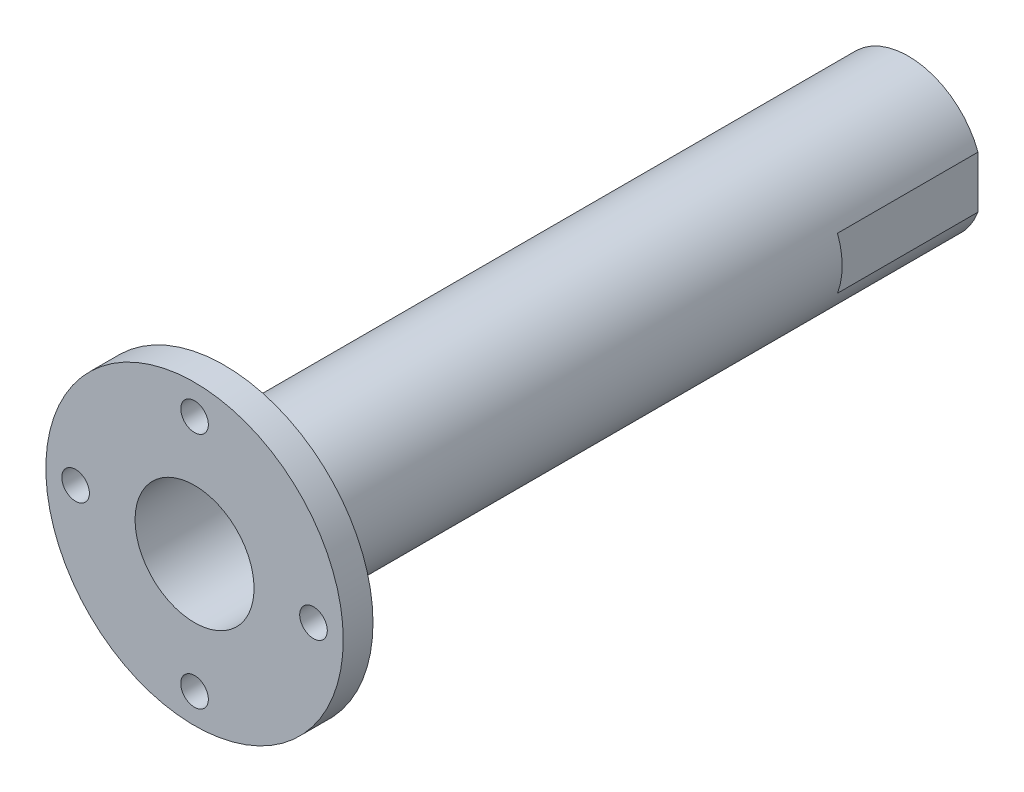
ISO-10303-21;
HEADER;
FILE_DESCRIPTION(('STEP AP214'),'2;1');
FILE_NAME('part.step','',(''),(''),'','','');
FILE_SCHEMA(('AUTOMOTIVE_DESIGN { 1 0 10303 214 1 1 1 1 }'));
ENDSEC;
DATA;
#1=APPLICATION_CONTEXT('core data for automotive mechanical design processes');
#2=APPLICATION_PROTOCOL_DEFINITION('international standard','automotive_design',2000,#1);
#3=PRODUCT_CONTEXT('',#1,'mechanical');
#4=PRODUCT('Part','Part','',(#3));
#5=PRODUCT_RELATED_PRODUCT_CATEGORY('part','',(#4));
#6=PRODUCT_DEFINITION_FORMATION('','',#4);
#7=PRODUCT_DEFINITION_CONTEXT('part definition',#1,'design');
#8=PRODUCT_DEFINITION('design','',#6,#7);
#9=PRODUCT_DEFINITION_SHAPE('','',#8);
#10=(LENGTH_UNIT() NAMED_UNIT(*) SI_UNIT(.MILLI.,.METRE.));
#11=(NAMED_UNIT(*) PLANE_ANGLE_UNIT() SI_UNIT($,.RADIAN.));
#12=(NAMED_UNIT(*) SI_UNIT($,.STERADIAN.) SOLID_ANGLE_UNIT());
#13=UNCERTAINTY_MEASURE_WITH_UNIT(LENGTH_MEASURE(1.E-05),#10,'distance_accuracy_value','');
#14=(GEOMETRIC_REPRESENTATION_CONTEXT(3) GLOBAL_UNCERTAINTY_ASSIGNED_CONTEXT((#13)) GLOBAL_UNIT_ASSIGNED_CONTEXT((#10,
#11,#12)) REPRESENTATION_CONTEXT('',''));
#15=CARTESIAN_POINT('',(0.,0.,0.));
#16=DIRECTION('',(0.,0.,1.));
#17=DIRECTION('',(1.,0.,0.));
#18=AXIS2_PLACEMENT_3D('',#15,#16,#17);
#19=CARTESIAN_POINT('',(0.,0.,76.2));
#20=DIRECTION('',(0.,0.,-1.));
#21=DIRECTION('',(-1.,0.,0.));
#22=AXIS2_PLACEMENT_3D('',#19,#20,#21);
#23=CYLINDRICAL_SURFACE('',#22,7.9375);
#24=CARTESIAN_POINT('',(0.,0.,15.));
#25=DIRECTION('',(0.,0.,-1.));
#26=DIRECTION('',(-1.,0.,0.));
#27=AXIS2_PLACEMENT_3D('',#24,#25,#26);
#28=CIRCLE('',#27,7.9375);
#29=CARTESIAN_POINT('',(7.4375,2.77263412660236,15.));
#30=VERTEX_POINT('',#29);
#31=CARTESIAN_POINT('',(7.4375,-2.77263412660236,15.));
#32=VERTEX_POINT('',#31);
#33=EDGE_CURVE('E14',#30,#32,#28,.T.);
#34=ORIENTED_EDGE('',*,*,#33,.F.);
#35=DIRECTION('',(0.,0.,-1.));
#36=VECTOR('',#35,1.);
#37=CARTESIAN_POINT('',(7.4375,2.77263412660236,76.2));
#38=LINE('',#37,#36);
#39=CARTESIAN_POINT('',(7.4375,2.77263412660236,0.));
#40=VERTEX_POINT('',#39);
#41=EDGE_CURVE('E71',#30,#40,#38,.T.);
#42=ORIENTED_EDGE('',*,*,#41,.T.);
#43=CARTESIAN_POINT('',(0.,0.,0.));
#44=DIRECTION('',(0.,0.,1.));
#45=DIRECTION('',(1.,0.,0.));
#46=AXIS2_PLACEMENT_3D('',#43,#44,#45);
#47=CIRCLE('',#46,7.9375);
#48=CARTESIAN_POINT('',(7.4375,-2.77263412660236,0.));
#49=VERTEX_POINT('',#48);
#50=EDGE_CURVE('E78',#40,#49,#47,.T.);
#51=ORIENTED_EDGE('',*,*,#50,.T.);
#52=DIRECTION('',(0.,0.,-1.));
#53=VECTOR('',#52,1.);
#54=CARTESIAN_POINT('',(7.4375,-2.77263412660236,76.2));
#55=LINE('',#54,#53);
#56=EDGE_CURVE('E59',#49,#32,#55,.F.);
#57=ORIENTED_EDGE('',*,*,#56,.T.);
#58=EDGE_LOOP('',(#34,#42,#51,#57));
#59=FACE_BOUND('',#58,.T.);
#60=CARTESIAN_POINT('',(0.,0.,73.025));
#61=DIRECTION('',(0.,0.,1.));
#62=DIRECTION('',(1.,0.,0.));
#63=AXIS2_PLACEMENT_3D('',#60,#61,#62);
#64=CIRCLE('',#63,7.9375);
#65=CARTESIAN_POINT('',(7.9375,0.,73.025));
#66=VERTEX_POINT('',#65);
#67=EDGE_CURVE('E75',#66,#66,#64,.T.);
#68=ORIENTED_EDGE('',*,*,#67,.F.);
#69=EDGE_LOOP('',(#68));
#70=FACE_BOUND('',#69,.T.);
#71=ADVANCED_FACE('F45',(#59,#70),#23,.T.);
#72=CARTESIAN_POINT('',(0.,0.,76.2));
#73=DIRECTION('',(0.,0.,1.));
#74=DIRECTION('',(1.,0.,0.));
#75=AXIS2_PLACEMENT_3D('',#72,#73,#74);
#76=PLANE('',#75);
#77=CARTESIAN_POINT('',(0.,12.7,76.2));
#78=DIRECTION('',(0.,0.,1.));
#79=DIRECTION('',(1.,0.,0.));
#80=AXIS2_PLACEMENT_3D('',#77,#78,#79);
#81=CIRCLE('',#80,1.4732);
#82=CARTESIAN_POINT('',(1.4732,12.7,76.2));
#83=VERTEX_POINT('',#82);
#84=EDGE_CURVE('E79',#83,#83,#81,.T.);
#85=ORIENTED_EDGE('',*,*,#84,.F.);
#86=EDGE_LOOP('',(#85));
#87=FACE_BOUND('',#86,.T.);
#88=CARTESIAN_POINT('',(0.,-12.7,76.2));
#89=DIRECTION('',(0.,0.,1.));
#90=DIRECTION('',(1.,0.,0.));
#91=AXIS2_PLACEMENT_3D('',#88,#89,#90);
#92=CIRCLE('',#91,1.4732);
#93=CARTESIAN_POINT('',(1.4732,-12.7,76.2));
#94=VERTEX_POINT('',#93);
#95=EDGE_CURVE('E114',#94,#94,#92,.T.);
#96=ORIENTED_EDGE('',*,*,#95,.F.);
#97=EDGE_LOOP('',(#96));
#98=FACE_BOUND('',#97,.T.);
#99=CARTESIAN_POINT('',(12.7,0.,76.2));
#100=DIRECTION('',(0.,0.,1.));
#101=DIRECTION('',(1.,0.,0.));
#102=AXIS2_PLACEMENT_3D('',#99,#100,#101);
#103=CIRCLE('',#102,1.4732);
#104=CARTESIAN_POINT('',(14.1732,0.,76.2));
#105=VERTEX_POINT('',#104);
#106=EDGE_CURVE('E108',#105,#105,#103,.T.);
#107=ORIENTED_EDGE('',*,*,#106,.F.);
#108=EDGE_LOOP('',(#107));
#109=FACE_BOUND('',#108,.T.);
#110=CARTESIAN_POINT('',(-12.7,0.,76.2));
#111=DIRECTION('',(0.,0.,1.));
#112=DIRECTION('',(1.,0.,0.));
#113=AXIS2_PLACEMENT_3D('',#110,#111,#112);
#114=CIRCLE('',#113,1.4732);
#115=CARTESIAN_POINT('',(-11.2268,0.,76.2));
#116=VERTEX_POINT('',#115);
#117=EDGE_CURVE('E102',#116,#116,#114,.T.);
#118=ORIENTED_EDGE('',*,*,#117,.F.);
#119=EDGE_LOOP('',(#118));
#120=FACE_BOUND('',#119,.T.);
#121=CARTESIAN_POINT('',(0.,0.,76.2));
#122=DIRECTION('',(0.,0.,1.));
#123=DIRECTION('',(1.,0.,0.));
#124=AXIS2_PLACEMENT_3D('',#121,#122,#123);
#125=CIRCLE('',#124,6.35);
#126=CARTESIAN_POINT('',(-6.35,0.,76.2));
#127=VERTEX_POINT('',#126);
#128=EDGE_CURVE('E83',#127,#127,#125,.T.);
#129=ORIENTED_EDGE('',*,*,#128,.F.);
#130=EDGE_LOOP('',(#129));
#131=FACE_BOUND('',#130,.T.);
#132=CARTESIAN_POINT('',(0.,0.,76.2));
#133=DIRECTION('',(0.,0.,1.));
#134=DIRECTION('',(1.,0.,0.));
#135=AXIS2_PLACEMENT_3D('',#132,#133,#134);
#136=CIRCLE('',#135,15.875);
#137=CARTESIAN_POINT('',(15.875,0.,76.2));
#138=VERTEX_POINT('',#137);
#139=EDGE_CURVE('E94',#138,#138,#136,.T.);
#140=ORIENTED_EDGE('',*,*,#139,.T.);
#141=EDGE_LOOP('',(#140));
#142=FACE_BOUND('',#141,.T.);
#143=ADVANCED_FACE('F137',(#87,#98,#109,#120,#131,#142),#76,.T.);
#144=CARTESIAN_POINT('',(0.,0.,0.));
#145=DIRECTION('',(0.,0.,1.));
#146=DIRECTION('',(1.,0.,0.));
#147=AXIS2_PLACEMENT_3D('',#144,#145,#146);
#148=PLANE('',#147);
#149=ORIENTED_EDGE('',*,*,#50,.F.);
#150=DIRECTION('',(0.,-1.,0.));
#151=VECTOR('',#150,1.);
#152=CARTESIAN_POINT('',(7.4375,0.,0.));
#153=LINE('',#152,#151);
#154=EDGE_CURVE('E52',#40,#49,#153,.T.);
#155=ORIENTED_EDGE('',*,*,#154,.T.);
#156=EDGE_LOOP('',(#149,#155));
#157=FACE_BOUND('',#156,.T.);
#158=CARTESIAN_POINT('',(0.,0.,0.));
#159=DIRECTION('',(0.,0.,1.));
#160=DIRECTION('',(1.,0.,0.));
#161=AXIS2_PLACEMENT_3D('',#158,#159,#160);
#162=CIRCLE('',#161,6.35);
#163=CARTESIAN_POINT('',(-6.35,0.,0.));
#164=VERTEX_POINT('',#163);
#165=EDGE_CURVE('E88',#164,#164,#162,.T.);
#166=ORIENTED_EDGE('',*,*,#165,.T.);
#167=EDGE_LOOP('',(#166));
#168=FACE_BOUND('',#167,.T.);
#169=ADVANCED_FACE('F81',(#157,#168),#148,.F.);
#170=CARTESIAN_POINT('',(0.,0.,76.2));
#171=DIRECTION('',(0.,0.,-1.));
#172=DIRECTION('',(-1.,0.,0.));
#173=AXIS2_PLACEMENT_3D('',#170,#171,#172);
#174=CYLINDRICAL_SURFACE('',#173,6.35);
#175=CARTESIAN_POINT('',(-6.35,0.,76.2));
#176=CARTESIAN_POINT('',(-6.35,0.,75.40625));
#177=CARTESIAN_POINT('',(-6.35,0.,74.6125));
#178=CARTESIAN_POINT('',(-6.35,0.,73.025));
#179=CARTESIAN_POINT('',(-6.35,0.,72.23125));
#180=CARTESIAN_POINT('',(-6.35,0.,70.64375));
#181=CARTESIAN_POINT('',(-6.35,0.,69.85));
#182=CARTESIAN_POINT('',(-6.35,0.,68.2625));
#183=CARTESIAN_POINT('',(-6.35,0.,67.46875));
#184=CARTESIAN_POINT('',(-6.35,0.,65.88125));
#185=CARTESIAN_POINT('',(-6.35,0.,65.0875));
#186=CARTESIAN_POINT('',(-6.35,0.,63.5));
#187=CARTESIAN_POINT('',(-6.35,0.,62.70625));
#188=CARTESIAN_POINT('',(-6.35,0.,61.11875));
#189=CARTESIAN_POINT('',(-6.35,0.,60.325));
#190=CARTESIAN_POINT('',(-6.35,0.,58.7375));
#191=CARTESIAN_POINT('',(-6.35,0.,57.94375));
#192=CARTESIAN_POINT('',(-6.35,0.,56.35625));
#193=CARTESIAN_POINT('',(-6.35,0.,55.5625));
#194=CARTESIAN_POINT('',(-6.35,0.,53.975));
#195=CARTESIAN_POINT('',(-6.35,0.,53.18125));
#196=CARTESIAN_POINT('',(-6.35,0.,51.59375));
#197=CARTESIAN_POINT('',(-6.35,0.,50.8));
#198=CARTESIAN_POINT('',(-6.35,0.,49.2125));
#199=CARTESIAN_POINT('',(-6.35,0.,48.41875));
#200=CARTESIAN_POINT('',(-6.35,0.,46.83125));
#201=CARTESIAN_POINT('',(-6.35,0.,46.0375));
#202=CARTESIAN_POINT('',(-6.35,0.,44.45));
#203=CARTESIAN_POINT('',(-6.35,0.,43.65625));
#204=CARTESIAN_POINT('',(-6.35,0.,42.06875));
#205=CARTESIAN_POINT('',(-6.35,0.,41.275));
#206=CARTESIAN_POINT('',(-6.35,0.,39.6875));
#207=CARTESIAN_POINT('',(-6.35,0.,38.89375));
#208=CARTESIAN_POINT('',(-6.35,0.,37.30625));
#209=CARTESIAN_POINT('',(-6.35,0.,36.5125));
#210=CARTESIAN_POINT('',(-6.35,0.,34.925));
#211=CARTESIAN_POINT('',(-6.35,0.,34.13125));
#212=CARTESIAN_POINT('',(-6.35,0.,32.54375));
#213=CARTESIAN_POINT('',(-6.35,0.,31.75));
#214=CARTESIAN_POINT('',(-6.35,0.,30.1625));
#215=CARTESIAN_POINT('',(-6.35,0.,29.36875));
#216=CARTESIAN_POINT('',(-6.35,0.,27.78125));
#217=CARTESIAN_POINT('',(-6.35,0.,26.9875));
#218=CARTESIAN_POINT('',(-6.35,0.,25.4));
#219=CARTESIAN_POINT('',(-6.35,0.,24.60625));
#220=CARTESIAN_POINT('',(-6.35,0.,23.01875));
#221=CARTESIAN_POINT('',(-6.35,0.,22.225));
#222=CARTESIAN_POINT('',(-6.35,0.,20.6375));
#223=CARTESIAN_POINT('',(-6.35,0.,19.84375));
#224=CARTESIAN_POINT('',(-6.35,0.,18.25625));
#225=CARTESIAN_POINT('',(-6.35,0.,17.4625));
#226=CARTESIAN_POINT('',(-6.35,0.,15.875));
#227=CARTESIAN_POINT('',(-6.35,0.,15.08125));
#228=CARTESIAN_POINT('',(-6.35,0.,13.49375));
#229=CARTESIAN_POINT('',(-6.35,0.,12.7));
#230=CARTESIAN_POINT('',(-6.35,0.,11.1125));
#231=CARTESIAN_POINT('',(-6.35,0.,10.31875));
#232=CARTESIAN_POINT('',(-6.35,0.,8.73125));
#233=CARTESIAN_POINT('',(-6.35,0.,7.93750000000001));
#234=CARTESIAN_POINT('',(-6.35,0.,6.35));
#235=CARTESIAN_POINT('',(-6.35,0.,5.55625));
#236=CARTESIAN_POINT('',(-6.35,0.,3.96875));
#237=CARTESIAN_POINT('',(-6.35,0.,3.175));
#238=CARTESIAN_POINT('',(-6.35,0.,1.5875));
#239=CARTESIAN_POINT('',(-6.35,0.,0.793750000000001));
#240=CARTESIAN_POINT('',(-6.35,0.,0.));
#241=B_SPLINE_CURVE_WITH_KNOTS('',3,(#175,#176,#177,#178,#179,#180,#181,#182,#183,#184,#185,
#186,#187,#188,#189,#190,#191,#192,#193,#194,#195,#196,#197,#198,#199,#200,#201,#202,#203,#204,
#205,#206,#207,#208,#209,#210,#211,#212,#213,#214,#215,#216,#217,#218,#219,#220,#221,#222,#223,
#224,#225,#226,#227,#228,#229,#230,#231,#232,#233,#234,#235,#236,#237,#238,#239,#240),
.UNSPECIFIED.,.F.,.F.,(4,2,2,2,2,2,2,2,2,2,2,2,2,2,2,2,2,2,2,2,2,2,2,2,2,2,2,2,2,2,2,2,4),(0.,
2.38124999999999,4.76249999999999,7.14374999999999,9.52499999999999,11.90625,14.2875,16.66875,
19.05,21.43125,23.8125,26.19375,28.575,30.95625,33.3375,35.71875,38.1,40.48125,42.8625,45.24375,
47.625,50.00625,52.3875,54.76875,57.15,59.53125,61.9125,64.29375,66.675,69.05625,71.4375,
73.81875,76.2),.UNSPECIFIED.);
#242=EDGE_CURVE('BSEAM146',#127,#164,#241,.T.);
#243=ORIENTED_EDGE('',*,*,#128,.T.);
#244=ORIENTED_EDGE('',*,*,#165,.F.);
#245=ORIENTED_EDGE('',*,*,#242,.T.);
#246=ORIENTED_EDGE('',*,*,#242,.F.);
#247=EDGE_LOOP('',(#243,#245,#244,#246));
#248=FACE_BOUND('',#247,.T.);
#249=ADVANCED_FACE('F146',(#248),#174,.F.);
#250=CARTESIAN_POINT('',(0.,0.,73.025));
#251=DIRECTION('',(0.,0.,1.));
#252=DIRECTION('',(1.,0.,0.));
#253=AXIS2_PLACEMENT_3D('',#250,#251,#252);
#254=PLANE('',#253);
#255=CARTESIAN_POINT('',(0.,12.7,73.025));
#256=DIRECTION('',(0.,0.,1.));
#257=DIRECTION('',(1.,0.,0.));
#258=AXIS2_PLACEMENT_3D('',#255,#256,#257);
#259=CIRCLE('',#258,1.4732);
#260=CARTESIAN_POINT('',(1.4732,12.7,73.025));
#261=VERTEX_POINT('',#260);
#262=EDGE_CURVE('E117',#261,#261,#259,.T.);
#263=ORIENTED_EDGE('',*,*,#262,.T.);
#264=EDGE_LOOP('',(#263));
#265=FACE_BOUND('',#264,.T.);
#266=CARTESIAN_POINT('',(0.,-12.7,73.025));
#267=DIRECTION('',(0.,0.,1.));
#268=DIRECTION('',(1.,0.,0.));
#269=AXIS2_PLACEMENT_3D('',#266,#267,#268);
#270=CIRCLE('',#269,1.4732);
#271=CARTESIAN_POINT('',(1.4732,-12.7,73.025));
#272=VERTEX_POINT('',#271);
#273=EDGE_CURVE('E111',#272,#272,#270,.T.);
#274=ORIENTED_EDGE('',*,*,#273,.T.);
#275=EDGE_LOOP('',(#274));
#276=FACE_BOUND('',#275,.T.);
#277=CARTESIAN_POINT('',(12.7,0.,73.025));
#278=DIRECTION('',(0.,0.,1.));
#279=DIRECTION('',(1.,0.,0.));
#280=AXIS2_PLACEMENT_3D('',#277,#278,#279);
#281=CIRCLE('',#280,1.4732);
#282=CARTESIAN_POINT('',(14.1732,0.,73.025));
#283=VERTEX_POINT('',#282);
#284=EDGE_CURVE('E105',#283,#283,#281,.T.);
#285=ORIENTED_EDGE('',*,*,#284,.T.);
#286=EDGE_LOOP('',(#285));
#287=FACE_BOUND('',#286,.T.);
#288=CARTESIAN_POINT('',(-12.7,0.,73.025));
#289=DIRECTION('',(0.,0.,1.));
#290=DIRECTION('',(1.,0.,0.));
#291=AXIS2_PLACEMENT_3D('',#288,#289,#290);
#292=CIRCLE('',#291,1.4732);
#293=CARTESIAN_POINT('',(-11.2268,0.,73.025));
#294=VERTEX_POINT('',#293);
#295=EDGE_CURVE('E97',#294,#294,#292,.T.);
#296=ORIENTED_EDGE('',*,*,#295,.T.);
#297=EDGE_LOOP('',(#296));
#298=FACE_BOUND('',#297,.T.);
#299=CARTESIAN_POINT('',(0.,0.,73.025));
#300=DIRECTION('',(0.,0.,1.));
#301=DIRECTION('',(1.,0.,0.));
#302=AXIS2_PLACEMENT_3D('',#299,#300,#301);
#303=CIRCLE('',#302,15.875);
#304=CARTESIAN_POINT('',(15.875,0.,73.025));
#305=VERTEX_POINT('',#304);
#306=EDGE_CURVE('E92',#305,#305,#303,.T.);
#307=ORIENTED_EDGE('',*,*,#306,.F.);
#308=EDGE_LOOP('',(#307));
#309=FACE_BOUND('',#308,.T.);
#310=ORIENTED_EDGE('',*,*,#67,.T.);
#311=EDGE_LOOP('',(#310));
#312=FACE_BOUND('',#311,.T.);
#313=ADVANCED_FACE('F152',(#265,#276,#287,#298,#309,#312),#254,.F.);
#314=CARTESIAN_POINT('',(0.,0.,73.025));
#315=DIRECTION('',(0.,0.,1.));
#316=DIRECTION('',(1.,0.,0.));
#317=AXIS2_PLACEMENT_3D('',#314,#315,#316);
#318=CYLINDRICAL_SURFACE('',#317,15.875);
#319=ORIENTED_EDGE('',*,*,#306,.T.);
#320=EDGE_LOOP('',(#319));
#321=FACE_BOUND('',#320,.T.);
#322=ORIENTED_EDGE('',*,*,#139,.F.);
#323=EDGE_LOOP('',(#322));
#324=FACE_BOUND('',#323,.T.);
#325=ADVANCED_FACE('F154',(#321,#324),#318,.T.);
#326=CARTESIAN_POINT('',(-12.7,0.,76.2));
#327=DIRECTION('',(0.,0.,1.));
#328=DIRECTION('',(1.,0.,0.));
#329=AXIS2_PLACEMENT_3D('',#326,#327,#328);
#330=CYLINDRICAL_SURFACE('',#329,1.4732);
#331=ORIENTED_EDGE('',*,*,#117,.T.);
#332=EDGE_LOOP('',(#331));
#333=FACE_BOUND('',#332,.T.);
#334=ORIENTED_EDGE('',*,*,#295,.F.);
#335=EDGE_LOOP('',(#334));
#336=FACE_BOUND('',#335,.T.);
#337=ADVANCED_FACE('F157',(#333,#336),#330,.F.);
#338=CARTESIAN_POINT('',(12.7,0.,76.2));
#339=DIRECTION('',(0.,0.,1.));
#340=DIRECTION('',(1.,0.,0.));
#341=AXIS2_PLACEMENT_3D('',#338,#339,#340);
#342=CYLINDRICAL_SURFACE('',#341,1.4732);
#343=ORIENTED_EDGE('',*,*,#106,.T.);
#344=EDGE_LOOP('',(#343));
#345=FACE_BOUND('',#344,.T.);
#346=ORIENTED_EDGE('',*,*,#284,.F.);
#347=EDGE_LOOP('',(#346));
#348=FACE_BOUND('',#347,.T.);
#349=ADVANCED_FACE('F164',(#345,#348),#342,.F.);
#350=CARTESIAN_POINT('',(0.,-12.7,76.2));
#351=DIRECTION('',(0.,0.,1.));
#352=DIRECTION('',(1.,0.,0.));
#353=AXIS2_PLACEMENT_3D('',#350,#351,#352);
#354=CYLINDRICAL_SURFACE('',#353,1.4732);
#355=ORIENTED_EDGE('',*,*,#95,.T.);
#356=EDGE_LOOP('',(#355));
#357=FACE_BOUND('',#356,.T.);
#358=ORIENTED_EDGE('',*,*,#273,.F.);
#359=EDGE_LOOP('',(#358));
#360=FACE_BOUND('',#359,.T.);
#361=ADVANCED_FACE('F133',(#357,#360),#354,.F.);
#362=CARTESIAN_POINT('',(0.,12.7,76.2));
#363=DIRECTION('',(0.,0.,1.));
#364=DIRECTION('',(1.,0.,0.));
#365=AXIS2_PLACEMENT_3D('',#362,#363,#364);
#366=CYLINDRICAL_SURFACE('',#365,1.4732);
#367=ORIENTED_EDGE('',*,*,#84,.T.);
#368=EDGE_LOOP('',(#367));
#369=FACE_BOUND('',#368,.T.);
#370=ORIENTED_EDGE('',*,*,#262,.F.);
#371=EDGE_LOOP('',(#370));
#372=FACE_BOUND('',#371,.T.);
#373=ADVANCED_FACE('F126',(#369,#372),#366,.F.);
#374=CARTESIAN_POINT('',(0.,15.875,15.));
#375=DIRECTION('',(0.,0.,-1.));
#376=DIRECTION('',(-1.,0.,0.));
#377=AXIS2_PLACEMENT_3D('',#374,#375,#376);
#378=PLANE('',#377);
#379=ORIENTED_EDGE('',*,*,#33,.T.);
#380=DIRECTION('',(0.,-1.,0.));
#381=VECTOR('',#380,1.);
#382=CARTESIAN_POINT('',(7.4375,15.875,15.));
#383=LINE('',#382,#381);
#384=EDGE_CURVE('E123',#30,#32,#383,.T.);
#385=ORIENTED_EDGE('',*,*,#384,.F.);
#386=EDGE_LOOP('',(#379,#385));
#387=FACE_BOUND('',#386,.T.);
#388=ADVANCED_FACE('F124',(#387),#378,.T.);
#389=CARTESIAN_POINT('',(7.4375,15.875,0.));
#390=DIRECTION('',(-1.,0.,0.));
#391=DIRECTION('',(0.,0.,1.));
#392=AXIS2_PLACEMENT_3D('',#389,#390,#391);
#393=PLANE('',#392);
#394=ORIENTED_EDGE('',*,*,#384,.T.);
#395=ORIENTED_EDGE('',*,*,#56,.F.);
#396=ORIENTED_EDGE('',*,*,#154,.F.);
#397=ORIENTED_EDGE('',*,*,#41,.F.);
#398=EDGE_LOOP('',(#394,#395,#396,#397));
#399=FACE_BOUND('',#398,.T.);
#400=ADVANCED_FACE('F70',(#399),#393,.F.);
#401=CLOSED_SHELL('',(#71,#143,#169,#249,#313,#325,#337,#349,#361,#373,#388,#400));
#402=MANIFOLD_SOLID_BREP('B2',#401);
#403=ADVANCED_BREP_SHAPE_REPRESENTATION('',(#18,#402),#14);
#404=SHAPE_DEFINITION_REPRESENTATION(#9,#403);
ENDSEC;
END-ISO-10303-21;
